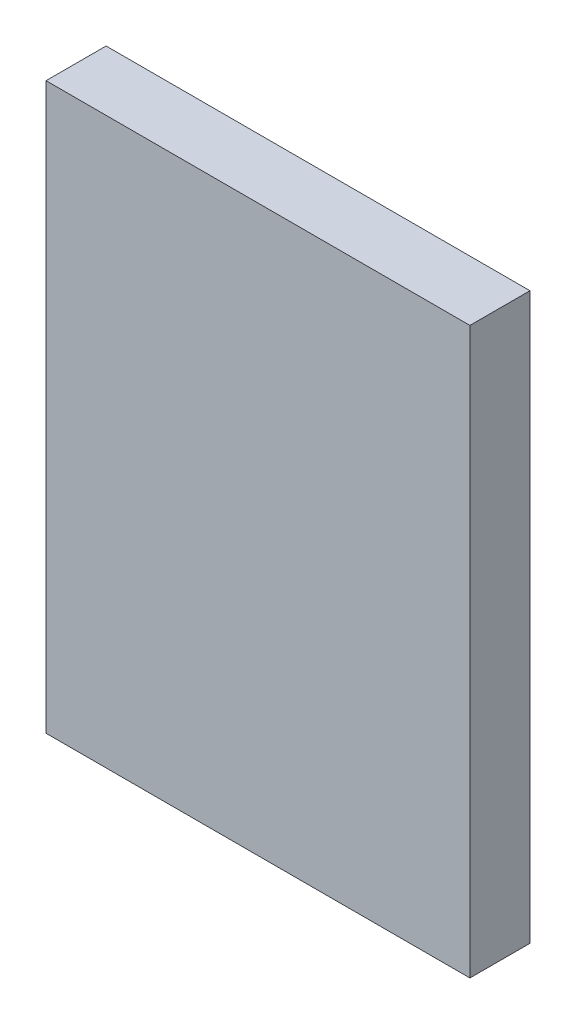
ISO-10303-21;
HEADER;
FILE_DESCRIPTION(('STEP AP214'),'2;1');
FILE_NAME('part.step','',(''),(''),'','','');
FILE_SCHEMA(('AUTOMOTIVE_DESIGN { 1 0 10303 214 1 1 1 1 }'));
ENDSEC;
DATA;
#1=APPLICATION_CONTEXT('core data for automotive mechanical design processes');
#2=APPLICATION_PROTOCOL_DEFINITION('international standard','automotive_design',2000,#1);
#3=PRODUCT_CONTEXT('',#1,'mechanical');
#4=PRODUCT('Part','Part','',(#3));
#5=PRODUCT_RELATED_PRODUCT_CATEGORY('part','',(#4));
#6=PRODUCT_DEFINITION_FORMATION('','',#4);
#7=PRODUCT_DEFINITION_CONTEXT('part definition',#1,'design');
#8=PRODUCT_DEFINITION('design','',#6,#7);
#9=PRODUCT_DEFINITION_SHAPE('','',#8);
#10=(LENGTH_UNIT() NAMED_UNIT(*) SI_UNIT(.MILLI.,.METRE.));
#11=(NAMED_UNIT(*) PLANE_ANGLE_UNIT() SI_UNIT($,.RADIAN.));
#12=(NAMED_UNIT(*) SI_UNIT($,.STERADIAN.) SOLID_ANGLE_UNIT());
#13=UNCERTAINTY_MEASURE_WITH_UNIT(LENGTH_MEASURE(1.E-05),#10,'distance_accuracy_value','');
#14=(GEOMETRIC_REPRESENTATION_CONTEXT(3) GLOBAL_UNCERTAINTY_ASSIGNED_CONTEXT((#13)) GLOBAL_UNIT_ASSIGNED_CONTEXT((#10,
#11,#12)) REPRESENTATION_CONTEXT('',''));
#15=CARTESIAN_POINT('',(0.,0.,0.));
#16=DIRECTION('',(0.,0.,1.));
#17=DIRECTION('',(1.,0.,0.));
#18=AXIS2_PLACEMENT_3D('',#15,#16,#17);
#19=CARTESIAN_POINT('',(36.75,6.5724,-0.85));
#20=DIRECTION('',(-1.,0.,0.));
#21=DIRECTION('',(0.,0.,1.));
#22=AXIS2_PLACEMENT_3D('',#19,#20,#21);
#23=PLANE('',#22);
#24=DIRECTION('',(0.,0.,-1.));
#25=VECTOR('',#24,1.);
#26=CARTESIAN_POINT('',(36.75000000001,-1.42760000001,0.));
#27=LINE('',#26,#25);
#28=CARTESIAN_POINT('',(36.75,-1.4276,0.));
#29=VERTEX_POINT('',#28);
#30=CARTESIAN_POINT('',(36.75,-1.4276,-0.85));
#31=VERTEX_POINT('',#30);
#32=EDGE_CURVE('E11',#29,#31,#27,.T.);
#33=ORIENTED_EDGE('',*,*,#32,.T.);
#34=DIRECTION('',(0.,1.,0.));
#35=VECTOR('',#34,1.);
#36=CARTESIAN_POINT('',(36.75000000001,-1.42760000001,-0.85000000001));
#37=LINE('',#36,#35);
#38=CARTESIAN_POINT('',(36.75,6.5724,-0.85));
#39=VERTEX_POINT('',#38);
#40=EDGE_CURVE('E28',#31,#39,#37,.T.);
#41=ORIENTED_EDGE('',*,*,#40,.T.);
#42=DIRECTION('',(0.,0.,-1.));
#43=VECTOR('',#42,1.);
#44=CARTESIAN_POINT('',(36.75000000001,6.57240000001,0.));
#45=LINE('',#44,#43);
#46=CARTESIAN_POINT('',(36.75,6.5724,0.));
#47=VERTEX_POINT('',#46);
#48=EDGE_CURVE('E62',#47,#39,#45,.T.);
#49=ORIENTED_EDGE('',*,*,#48,.F.);
#50=DIRECTION('',(0.,1.,0.));
#51=VECTOR('',#50,1.);
#52=CARTESIAN_POINT('',(36.75000000001,-1.42760000001,0.));
#53=LINE('',#52,#51);
#54=EDGE_CURVE('E66',#29,#47,#53,.T.);
#55=ORIENTED_EDGE('',*,*,#54,.F.);
#56=EDGE_LOOP('',(#33,#41,#49,#55));
#57=FACE_BOUND('',#56,.T.);
#58=ADVANCED_FACE('F17',(#57),#23,.F.);
#59=CARTESIAN_POINT('',(36.75,2.5724,0.));
#60=DIRECTION('',(0.,0.,1.));
#61=DIRECTION('',(1.,0.,0.));
#62=AXIS2_PLACEMENT_3D('',#59,#60,#61);
#63=PLANE('',#62);
#64=DIRECTION('',(-1.,0.,0.));
#65=VECTOR('',#64,1.);
#66=CARTESIAN_POINT('',(36.75000000001,6.57240000001,0.));
#67=LINE('',#66,#65);
#68=CARTESIAN_POINT('',(30.75,6.5724,0.));
#69=VERTEX_POINT('',#68);
#70=EDGE_CURVE('E73',#47,#69,#67,.T.);
#71=ORIENTED_EDGE('',*,*,#70,.T.);
#72=DIRECTION('',(0.,-1.,0.));
#73=VECTOR('',#72,1.);
#74=CARTESIAN_POINT('',(30.75000000001,6.57240000001,0.));
#75=LINE('',#74,#73);
#76=CARTESIAN_POINT('',(30.75,-1.4276,0.));
#77=VERTEX_POINT('',#76);
#78=EDGE_CURVE('E77',#69,#77,#75,.T.);
#79=ORIENTED_EDGE('',*,*,#78,.T.);
#80=DIRECTION('',(1.,0.,0.));
#81=VECTOR('',#80,1.);
#82=CARTESIAN_POINT('',(30.75000000001,-1.42760000001,0.));
#83=LINE('',#82,#81);
#84=EDGE_CURVE('E90',#77,#29,#83,.T.);
#85=ORIENTED_EDGE('',*,*,#84,.T.);
#86=ORIENTED_EDGE('',*,*,#54,.T.);
#87=EDGE_LOOP('',(#71,#79,#85,#86));
#88=FACE_BOUND('',#87,.T.);
#89=ADVANCED_FACE('F75',(#88),#63,.T.);
#90=CARTESIAN_POINT('',(36.75,-1.4276,-0.85));
#91=DIRECTION('',(0.,1.,0.));
#92=DIRECTION('',(1.,0.,0.));
#93=AXIS2_PLACEMENT_3D('',#90,#91,#92);
#94=PLANE('',#93);
#95=DIRECTION('',(0.,0.,-1.));
#96=VECTOR('',#95,1.);
#97=CARTESIAN_POINT('',(30.75000000001,-1.42760000001,0.));
#98=LINE('',#97,#96);
#99=CARTESIAN_POINT('',(30.75,-1.4276,-0.85));
#100=VERTEX_POINT('',#99);
#101=EDGE_CURVE('E88',#77,#100,#98,.T.);
#102=ORIENTED_EDGE('',*,*,#101,.T.);
#103=DIRECTION('',(1.,0.,0.));
#104=VECTOR('',#103,1.);
#105=CARTESIAN_POINT('',(30.75000000001,-1.42760000001,-0.85000000001));
#106=LINE('',#105,#104);
#107=EDGE_CURVE('E21',#100,#31,#106,.T.);
#108=ORIENTED_EDGE('',*,*,#107,.T.);
#109=ORIENTED_EDGE('',*,*,#32,.F.);
#110=ORIENTED_EDGE('',*,*,#84,.F.);
#111=EDGE_LOOP('',(#102,#108,#109,#110));
#112=FACE_BOUND('',#111,.T.);
#113=ADVANCED_FACE('F117',(#112),#94,.F.);
#114=CARTESIAN_POINT('',(36.75,2.5724,-0.85));
#115=DIRECTION('',(0.,0.,1.));
#116=DIRECTION('',(1.,0.,0.));
#117=AXIS2_PLACEMENT_3D('',#114,#115,#116);
#118=PLANE('',#117);
#119=ORIENTED_EDGE('',*,*,#107,.F.);
#120=DIRECTION('',(0.,-1.,0.));
#121=VECTOR('',#120,1.);
#122=CARTESIAN_POINT('',(30.75000000001,6.57240000001,-0.85000000001));
#123=LINE('',#122,#121);
#124=CARTESIAN_POINT('',(30.75,6.5724,-0.85));
#125=VERTEX_POINT('',#124);
#126=EDGE_CURVE('E95',#125,#100,#123,.T.);
#127=ORIENTED_EDGE('',*,*,#126,.F.);
#128=DIRECTION('',(-1.,0.,0.));
#129=VECTOR('',#128,1.);
#130=CARTESIAN_POINT('',(33.75000000001,6.57240000001,-0.85000000001));
#131=LINE('',#130,#129);
#132=EDGE_CURVE('E93',#39,#125,#131,.T.);
#133=ORIENTED_EDGE('',*,*,#132,.F.);
#134=ORIENTED_EDGE('',*,*,#40,.F.);
#135=EDGE_LOOP('',(#119,#127,#133,#134));
#136=FACE_BOUND('',#135,.T.);
#137=ADVANCED_FACE('F118',(#136),#118,.F.);
#138=CARTESIAN_POINT('',(33.75,6.5724,-0.85));
#139=DIRECTION('',(0.,-1.,0.));
#140=DIRECTION('',(0.,0.,-1.));
#141=AXIS2_PLACEMENT_3D('',#138,#139,#140);
#142=PLANE('',#141);
#143=ORIENTED_EDGE('',*,*,#48,.T.);
#144=ORIENTED_EDGE('',*,*,#132,.T.);
#145=DIRECTION('',(0.,0.,-1.));
#146=VECTOR('',#145,1.);
#147=CARTESIAN_POINT('',(30.75000000001,6.57240000001,0.));
#148=LINE('',#147,#146);
#149=EDGE_CURVE('E86',#69,#125,#148,.T.);
#150=ORIENTED_EDGE('',*,*,#149,.F.);
#151=ORIENTED_EDGE('',*,*,#70,.F.);
#152=EDGE_LOOP('',(#143,#144,#150,#151));
#153=FACE_BOUND('',#152,.T.);
#154=ADVANCED_FACE('F19',(#153),#142,.F.);
#155=CARTESIAN_POINT('',(30.75,-1.4276,-0.85));
#156=DIRECTION('',(1.,0.,0.));
#157=DIRECTION('',(0.,1.,0.));
#158=AXIS2_PLACEMENT_3D('',#155,#156,#157);
#159=PLANE('',#158);
#160=ORIENTED_EDGE('',*,*,#149,.T.);
#161=ORIENTED_EDGE('',*,*,#126,.T.);
#162=ORIENTED_EDGE('',*,*,#101,.F.);
#163=ORIENTED_EDGE('',*,*,#78,.F.);
#164=EDGE_LOOP('',(#160,#161,#162,#163));
#165=FACE_BOUND('',#164,.T.);
#166=ADVANCED_FACE('F84',(#165),#159,.F.);
#167=CLOSED_SHELL('',(#58,#89,#113,#137,#154,#166));
#168=MANIFOLD_SOLID_BREP('B1',#167);
#169=ADVANCED_BREP_SHAPE_REPRESENTATION('',(#18,#168),#14);
#170=SHAPE_DEFINITION_REPRESENTATION(#9,#169);
ENDSEC;
END-ISO-10303-21;
